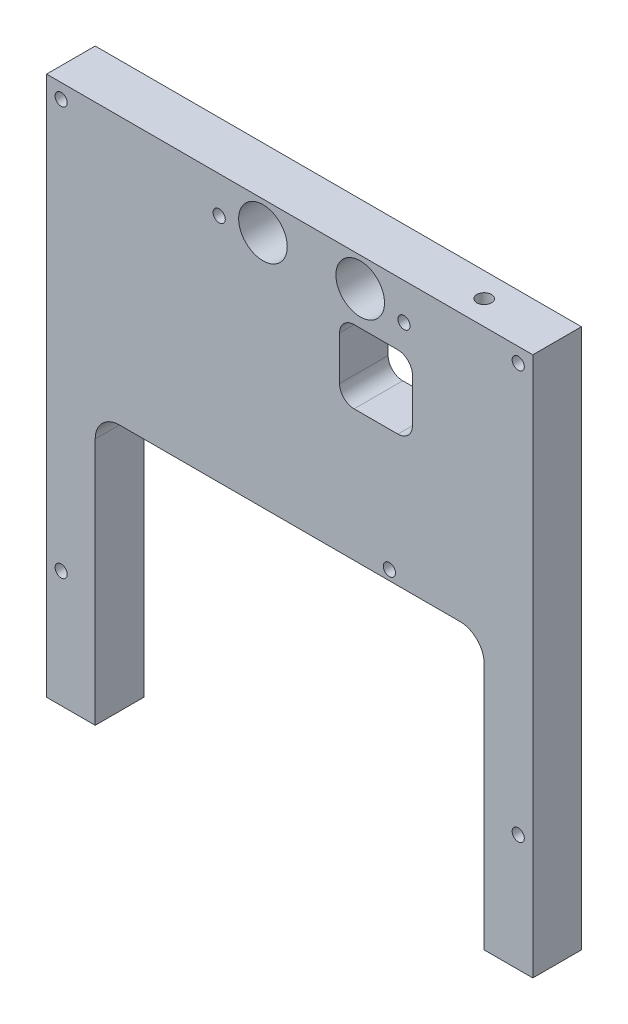
ISO-10303-21;
HEADER;
FILE_DESCRIPTION(('STEP AP214'),'2;1');
FILE_NAME('part.step','',(''),(''),'','','');
FILE_SCHEMA(('AUTOMOTIVE_DESIGN { 1 0 10303 214 1 1 1 1 }'));
ENDSEC;
DATA;
#1=APPLICATION_CONTEXT('core data for automotive mechanical design processes');
#2=APPLICATION_PROTOCOL_DEFINITION('international standard','automotive_design',2000,#1);
#3=PRODUCT_CONTEXT('',#1,'mechanical');
#4=PRODUCT('Part','Part','',(#3));
#5=PRODUCT_RELATED_PRODUCT_CATEGORY('part','',(#4));
#6=PRODUCT_DEFINITION_FORMATION('','',#4);
#7=PRODUCT_DEFINITION_CONTEXT('part definition',#1,'design');
#8=PRODUCT_DEFINITION('design','',#6,#7);
#9=PRODUCT_DEFINITION_SHAPE('','',#8);
#10=(LENGTH_UNIT() NAMED_UNIT(*) SI_UNIT(.MILLI.,.METRE.));
#11=(NAMED_UNIT(*) PLANE_ANGLE_UNIT() SI_UNIT($,.RADIAN.));
#12=(NAMED_UNIT(*) SI_UNIT($,.STERADIAN.) SOLID_ANGLE_UNIT());
#13=UNCERTAINTY_MEASURE_WITH_UNIT(LENGTH_MEASURE(1.E-05),#10,'distance_accuracy_value','');
#14=(GEOMETRIC_REPRESENTATION_CONTEXT(3) GLOBAL_UNCERTAINTY_ASSIGNED_CONTEXT((#13)) GLOBAL_UNIT_ASSIGNED_CONTEXT((#10,
#11,#12)) REPRESENTATION_CONTEXT('',''));
#15=CARTESIAN_POINT('',(0.,0.,0.));
#16=DIRECTION('',(0.,0.,1.));
#17=DIRECTION('',(1.,0.,0.));
#18=AXIS2_PLACEMENT_3D('',#15,#16,#17);
#19=CARTESIAN_POINT('',(35.,60.,10.));
#20=DIRECTION('',(0.,0.,1.));
#21=DIRECTION('',(1.,0.,0.));
#22=AXIS2_PLACEMENT_3D('',#19,#20,#21);
#23=PLANE('',#22);
#24=CARTESIAN_POINT('',(23.5,112.5,10.));
#25=DIRECTION('',(0.,0.,-1.));
#26=DIRECTION('',(-1.,0.,0.));
#27=AXIS2_PLACEMENT_3D('',#24,#25,#26);
#28=CIRCLE('',#27,1.25);
#29=CARTESIAN_POINT('',(22.25,112.5,10.));
#30=VERTEX_POINT('',#29);
#31=EDGE_CURVE('E411',#30,#30,#28,.T.);
#32=ORIENTED_EDGE('',*,*,#31,.T.);
#33=EDGE_LOOP('',(#32));
#34=FACE_BOUND('',#33,.T.);
#35=CARTESIAN_POINT('',(-14.5,112.5,10.));
#36=DIRECTION('',(0.,0.,-1.));
#37=DIRECTION('',(-1.,0.,0.));
#38=AXIS2_PLACEMENT_3D('',#35,#36,#37);
#39=CIRCLE('',#38,1.25);
#40=CARTESIAN_POINT('',(-15.75,112.5,10.));
#41=VERTEX_POINT('',#40);
#42=EDGE_CURVE('E418',#41,#41,#39,.T.);
#43=ORIENTED_EDGE('',*,*,#42,.T.);
#44=EDGE_LOOP('',(#43));
#45=FACE_BOUND('',#44,.T.);
#46=CARTESIAN_POINT('',(20.5,67.,10.));
#47=DIRECTION('',(0.,0.,-1.));
#48=DIRECTION('',(-1.,0.,0.));
#49=AXIS2_PLACEMENT_3D('',#46,#47,#48);
#50=CIRCLE('',#49,1.25);
#51=CARTESIAN_POINT('',(19.25,67.,10.));
#52=VERTEX_POINT('',#51);
#53=EDGE_CURVE('E424',#52,#52,#50,.T.);
#54=ORIENTED_EDGE('',*,*,#53,.T.);
#55=EDGE_LOOP('',(#54));
#56=FACE_BOUND('',#55,.T.);
#57=CARTESIAN_POINT('',(47.,117.,10.));
#58=DIRECTION('',(0.,0.,-1.));
#59=DIRECTION('',(-1.,0.,0.));
#60=AXIS2_PLACEMENT_3D('',#57,#58,#59);
#61=CIRCLE('',#60,1.24999999999999);
#62=CARTESIAN_POINT('',(45.75,117.,10.));
#63=VERTEX_POINT('',#62);
#64=EDGE_CURVE('E430',#63,#63,#61,.T.);
#65=ORIENTED_EDGE('',*,*,#64,.T.);
#66=EDGE_LOOP('',(#65));
#67=FACE_BOUND('',#66,.T.);
#68=CARTESIAN_POINT('',(-47.,117.,10.));
#69=DIRECTION('',(0.,0.,-1.));
#70=DIRECTION('',(-1.,0.,0.));
#71=AXIS2_PLACEMENT_3D('',#68,#69,#70);
#72=CIRCLE('',#71,1.24999999999999);
#73=CARTESIAN_POINT('',(-48.25,117.,10.));
#74=VERTEX_POINT('',#73);
#75=EDGE_CURVE('E436',#74,#74,#72,.T.);
#76=ORIENTED_EDGE('',*,*,#75,.T.);
#77=EDGE_LOOP('',(#76));
#78=FACE_BOUND('',#77,.T.);
#79=CARTESIAN_POINT('',(-47.,33.,10.));
#80=DIRECTION('',(0.,0.,-1.));
#81=DIRECTION('',(-1.,0.,0.));
#82=AXIS2_PLACEMENT_3D('',#79,#80,#81);
#83=CIRCLE('',#82,1.24999999999999);
#84=CARTESIAN_POINT('',(-48.25,33.,10.));
#85=VERTEX_POINT('',#84);
#86=EDGE_CURVE('E442',#85,#85,#83,.T.);
#87=ORIENTED_EDGE('',*,*,#86,.T.);
#88=EDGE_LOOP('',(#87));
#89=FACE_BOUND('',#88,.T.);
#90=CARTESIAN_POINT('',(47.,33.,10.));
#91=DIRECTION('',(0.,0.,-1.));
#92=DIRECTION('',(-1.,0.,0.));
#93=AXIS2_PLACEMENT_3D('',#90,#91,#92);
#94=CIRCLE('',#93,1.24999999999999);
#95=CARTESIAN_POINT('',(45.75,33.,10.));
#96=VERTEX_POINT('',#95);
#97=EDGE_CURVE('E448',#96,#96,#94,.T.);
#98=ORIENTED_EDGE('',*,*,#97,.T.);
#99=EDGE_LOOP('',(#98));
#100=FACE_BOUND('',#99,.T.);
#101=CARTESIAN_POINT('',(-5.5,114.,10.));
#102=DIRECTION('',(0.,0.,1.));
#103=DIRECTION('',(1.,0.,0.));
#104=AXIS2_PLACEMENT_3D('',#101,#102,#103);
#105=CIRCLE('',#104,5.);
#106=CARTESIAN_POINT('',(-0.499999999999995,114.,10.));
#107=VERTEX_POINT('',#106);
#108=EDGE_CURVE('E230',#107,#107,#105,.T.);
#109=ORIENTED_EDGE('',*,*,#108,.F.);
#110=EDGE_LOOP('',(#109));
#111=FACE_BOUND('',#110,.T.);
#112=DIRECTION('',(0.,1.,0.));
#113=VECTOR('',#112,1.);
#114=CARTESIAN_POINT('',(-40.,60.,10.));
#115=LINE('',#114,#113);
#116=CARTESIAN_POINT('',(-40.,8.99999999999998,10.));
#117=VERTEX_POINT('',#116);
#118=CARTESIAN_POINT('',(-40.,60.,10.));
#119=VERTEX_POINT('',#118);
#120=EDGE_CURVE('E254',#117,#119,#115,.T.);
#121=ORIENTED_EDGE('',*,*,#120,.T.);
#122=CARTESIAN_POINT('',(-35.,60.,10.));
#123=DIRECTION('',(0.,0.,-1.));
#124=DIRECTION('',(1.,0.,0.));
#125=AXIS2_PLACEMENT_3D('',#122,#123,#124);
#126=CIRCLE('',#125,5.);
#127=CARTESIAN_POINT('',(-35.,65.,10.));
#128=VERTEX_POINT('',#127);
#129=EDGE_CURVE('E257',#119,#128,#126,.T.);
#130=ORIENTED_EDGE('',*,*,#129,.T.);
#131=DIRECTION('',(1.,0.,0.));
#132=VECTOR('',#131,1.);
#133=CARTESIAN_POINT('',(35.,65.,10.));
#134=LINE('',#133,#132);
#135=CARTESIAN_POINT('',(35.,65.,10.));
#136=VERTEX_POINT('',#135);
#137=EDGE_CURVE('E260',#128,#136,#134,.T.);
#138=ORIENTED_EDGE('',*,*,#137,.T.);
#139=CARTESIAN_POINT('',(35.,60.,10.));
#140=DIRECTION('',(0.,0.,-1.));
#141=DIRECTION('',(1.,0.,0.));
#142=AXIS2_PLACEMENT_3D('',#139,#140,#141);
#143=CIRCLE('',#142,5.);
#144=CARTESIAN_POINT('',(40.,60.,10.));
#145=VERTEX_POINT('',#144);
#146=EDGE_CURVE('E262',#136,#145,#143,.T.);
#147=ORIENTED_EDGE('',*,*,#146,.T.);
#148=DIRECTION('',(0.,-1.,0.));
#149=VECTOR('',#148,1.);
#150=CARTESIAN_POINT('',(40.,8.99999999999998,10.));
#151=LINE('',#150,#149);
#152=CARTESIAN_POINT('',(40.,8.99999999999998,10.));
#153=VERTEX_POINT('',#152);
#154=EDGE_CURVE('E264',#145,#153,#151,.T.);
#155=ORIENTED_EDGE('',*,*,#154,.T.);
#156=DIRECTION('',(1.,0.,0.));
#157=VECTOR('',#156,1.);
#158=CARTESIAN_POINT('',(50.,8.99999999999998,10.));
#159=LINE('',#158,#157);
#160=CARTESIAN_POINT('',(50.,8.99999999999998,10.));
#161=VERTEX_POINT('',#160);
#162=EDGE_CURVE('E266',#153,#161,#159,.T.);
#163=ORIENTED_EDGE('',*,*,#162,.T.);
#164=DIRECTION('',(0.,1.,0.));
#165=VECTOR('',#164,1.);
#166=CARTESIAN_POINT('',(50.,120.,10.));
#167=LINE('',#166,#165);
#168=CARTESIAN_POINT('',(50.,120.,10.));
#169=VERTEX_POINT('',#168);
#170=EDGE_CURVE('E268',#161,#169,#167,.T.);
#171=ORIENTED_EDGE('',*,*,#170,.T.);
#172=DIRECTION('',(-1.,0.,0.));
#173=VECTOR('',#172,1.);
#174=CARTESIAN_POINT('',(-50.,120.,10.));
#175=LINE('',#174,#173);
#176=CARTESIAN_POINT('',(-50.,120.,10.));
#177=VERTEX_POINT('',#176);
#178=EDGE_CURVE('E270',#169,#177,#175,.T.);
#179=ORIENTED_EDGE('',*,*,#178,.T.);
#180=DIRECTION('',(0.,-1.,0.));
#181=VECTOR('',#180,1.);
#182=CARTESIAN_POINT('',(-50.,8.99999999999998,10.));
#183=LINE('',#182,#181);
#184=CARTESIAN_POINT('',(-50.,8.99999999999998,10.));
#185=VERTEX_POINT('',#184);
#186=EDGE_CURVE('E272',#177,#185,#183,.T.);
#187=ORIENTED_EDGE('',*,*,#186,.T.);
#188=DIRECTION('',(1.,0.,0.));
#189=VECTOR('',#188,1.);
#190=CARTESIAN_POINT('',(-40.,8.99999999999998,10.));
#191=LINE('',#190,#189);
#192=EDGE_CURVE('E274',#185,#117,#191,.T.);
#193=ORIENTED_EDGE('',*,*,#192,.T.);
#194=EDGE_LOOP('',(#121,#130,#138,#147,#155,#163,#171,#179,#187,#193));
#195=FACE_BOUND('',#194,.T.);
#196=CARTESIAN_POINT('',(14.5,114.,10.));
#197=DIRECTION('',(0.,0.,1.));
#198=DIRECTION('',(1.,0.,0.));
#199=AXIS2_PLACEMENT_3D('',#196,#197,#198);
#200=CIRCLE('',#199,5.);
#201=CARTESIAN_POINT('',(19.5,114.,10.));
#202=VERTEX_POINT('',#201);
#203=EDGE_CURVE('E236',#202,#202,#200,.T.);
#204=ORIENTED_EDGE('',*,*,#203,.F.);
#205=EDGE_LOOP('',(#204));
#206=FACE_BOUND('',#205,.T.);
#207=DIRECTION('',(-1.,0.,0.));
#208=VECTOR('',#207,1.);
#209=CARTESIAN_POINT('',(22.25,107.,10.));
#210=LINE('',#209,#208);
#211=CARTESIAN_POINT('',(22.25,107.,10.));
#212=VERTEX_POINT('',#211);
#213=CARTESIAN_POINT('',(13.25,107.,10.));
#214=VERTEX_POINT('',#213);
#215=EDGE_CURVE('E171',#212,#214,#210,.T.);
#216=ORIENTED_EDGE('',*,*,#215,.F.);
#217=CARTESIAN_POINT('',(22.25,104.,10.));
#218=DIRECTION('',(0.,0.,1.));
#219=DIRECTION('',(-1.,0.,0.));
#220=AXIS2_PLACEMENT_3D('',#217,#218,#219);
#221=CIRCLE('',#220,2.99999999999999);
#222=CARTESIAN_POINT('',(25.25,104.,10.));
#223=VERTEX_POINT('',#222);
#224=EDGE_CURVE('E163',#223,#212,#221,.T.);
#225=ORIENTED_EDGE('',*,*,#224,.F.);
#226=DIRECTION('',(0.,1.,0.));
#227=VECTOR('',#226,1.);
#228=CARTESIAN_POINT('',(25.25,104.,10.));
#229=LINE('',#228,#227);
#230=CARTESIAN_POINT('',(25.25,95.,10.));
#231=VERTEX_POINT('',#230);
#232=EDGE_CURVE('E197',#231,#223,#229,.T.);
#233=ORIENTED_EDGE('',*,*,#232,.F.);
#234=CARTESIAN_POINT('',(22.25,95.,10.));
#235=DIRECTION('',(0.,0.,1.));
#236=DIRECTION('',(-1.,0.,0.));
#237=AXIS2_PLACEMENT_3D('',#234,#235,#236);
#238=CIRCLE('',#237,3.00000000000001);
#239=CARTESIAN_POINT('',(22.25,92.,10.));
#240=VERTEX_POINT('',#239);
#241=EDGE_CURVE('E195',#240,#231,#238,.T.);
#242=ORIENTED_EDGE('',*,*,#241,.F.);
#243=DIRECTION('',(1.,0.,0.));
#244=VECTOR('',#243,1.);
#245=CARTESIAN_POINT('',(22.25,92.,10.));
#246=LINE('',#245,#244);
#247=CARTESIAN_POINT('',(13.25,92.,10.));
#248=VERTEX_POINT('',#247);
#249=EDGE_CURVE('E193',#248,#240,#246,.T.);
#250=ORIENTED_EDGE('',*,*,#249,.F.);
#251=CARTESIAN_POINT('',(13.25,95.,10.));
#252=DIRECTION('',(0.,0.,1.));
#253=DIRECTION('',(-1.,0.,0.));
#254=AXIS2_PLACEMENT_3D('',#251,#252,#253);
#255=CIRCLE('',#254,3.);
#256=CARTESIAN_POINT('',(10.25,95.,10.));
#257=VERTEX_POINT('',#256);
#258=EDGE_CURVE('E191',#257,#248,#255,.T.);
#259=ORIENTED_EDGE('',*,*,#258,.F.);
#260=DIRECTION('',(0.,-1.,0.));
#261=VECTOR('',#260,1.);
#262=CARTESIAN_POINT('',(10.25,104.,10.));
#263=LINE('',#262,#261);
#264=CARTESIAN_POINT('',(10.25,104.,10.));
#265=VERTEX_POINT('',#264);
#266=EDGE_CURVE('E186',#265,#257,#263,.T.);
#267=ORIENTED_EDGE('',*,*,#266,.F.);
#268=CARTESIAN_POINT('',(13.25,104.,10.));
#269=DIRECTION('',(0.,0.,1.));
#270=DIRECTION('',(1.,0.,0.));
#271=AXIS2_PLACEMENT_3D('',#268,#269,#270);
#272=CIRCLE('',#271,2.99999999999999);
#273=EDGE_CURVE('E184',#214,#265,#272,.T.);
#274=ORIENTED_EDGE('',*,*,#273,.F.);
#275=EDGE_LOOP('',(#216,#225,#233,#242,#250,#259,#267,#274));
#276=FACE_BOUND('',#275,.T.);
#277=ADVANCED_FACE('F32',(#34,#45,#56,#67,#78,#89,#100,#111,#195,#206,#276),#23,.T.);
#278=CARTESIAN_POINT('',(35.,60.,0.));
#279=DIRECTION('',(0.,0.,1.));
#280=DIRECTION('',(1.,0.,0.));
#281=AXIS2_PLACEMENT_3D('',#278,#279,#280);
#282=PLANE('',#281);
#283=CARTESIAN_POINT('',(23.5,112.5,0.));
#284=DIRECTION('',(0.,0.,-1.));
#285=DIRECTION('',(-1.,0.,0.));
#286=AXIS2_PLACEMENT_3D('',#283,#284,#285);
#287=CIRCLE('',#286,1.24999999999999);
#288=CARTESIAN_POINT('',(22.25,112.5,0.));
#289=VERTEX_POINT('',#288);
#290=EDGE_CURVE('E415',#289,#289,#287,.T.);
#291=ORIENTED_EDGE('',*,*,#290,.F.);
#292=EDGE_LOOP('',(#291));
#293=FACE_BOUND('',#292,.T.);
#294=CARTESIAN_POINT('',(-14.5,112.5,0.));
#295=DIRECTION('',(0.,0.,-1.));
#296=DIRECTION('',(-1.,0.,0.));
#297=AXIS2_PLACEMENT_3D('',#294,#295,#296);
#298=CIRCLE('',#297,1.24999999999999);
#299=CARTESIAN_POINT('',(-15.75,112.5,0.));
#300=VERTEX_POINT('',#299);
#301=EDGE_CURVE('E421',#300,#300,#298,.T.);
#302=ORIENTED_EDGE('',*,*,#301,.F.);
#303=EDGE_LOOP('',(#302));
#304=FACE_BOUND('',#303,.T.);
#305=CARTESIAN_POINT('',(20.5,67.,0.));
#306=DIRECTION('',(0.,0.,-1.));
#307=DIRECTION('',(-1.,0.,0.));
#308=AXIS2_PLACEMENT_3D('',#305,#306,#307);
#309=CIRCLE('',#308,1.24999999999999);
#310=CARTESIAN_POINT('',(19.25,67.,0.));
#311=VERTEX_POINT('',#310);
#312=EDGE_CURVE('E427',#311,#311,#309,.T.);
#313=ORIENTED_EDGE('',*,*,#312,.F.);
#314=EDGE_LOOP('',(#313));
#315=FACE_BOUND('',#314,.T.);
#316=CARTESIAN_POINT('',(47.,117.,0.));
#317=DIRECTION('',(0.,0.,-1.));
#318=DIRECTION('',(-1.,0.,0.));
#319=AXIS2_PLACEMENT_3D('',#316,#317,#318);
#320=CIRCLE('',#319,1.24999999999999);
#321=CARTESIAN_POINT('',(45.75,117.,0.));
#322=VERTEX_POINT('',#321);
#323=EDGE_CURVE('E433',#322,#322,#320,.T.);
#324=ORIENTED_EDGE('',*,*,#323,.F.);
#325=EDGE_LOOP('',(#324));
#326=FACE_BOUND('',#325,.T.);
#327=CARTESIAN_POINT('',(-47.,117.,0.));
#328=DIRECTION('',(0.,0.,-1.));
#329=DIRECTION('',(-1.,0.,0.));
#330=AXIS2_PLACEMENT_3D('',#327,#328,#329);
#331=CIRCLE('',#330,1.24999999999999);
#332=CARTESIAN_POINT('',(-48.25,117.,0.));
#333=VERTEX_POINT('',#332);
#334=EDGE_CURVE('E439',#333,#333,#331,.T.);
#335=ORIENTED_EDGE('',*,*,#334,.F.);
#336=EDGE_LOOP('',(#335));
#337=FACE_BOUND('',#336,.T.);
#338=CARTESIAN_POINT('',(-47.,33.,0.));
#339=DIRECTION('',(0.,0.,-1.));
#340=DIRECTION('',(-1.,0.,0.));
#341=AXIS2_PLACEMENT_3D('',#338,#339,#340);
#342=CIRCLE('',#341,1.24999999999999);
#343=CARTESIAN_POINT('',(-48.25,33.,0.));
#344=VERTEX_POINT('',#343);
#345=EDGE_CURVE('E445',#344,#344,#342,.T.);
#346=ORIENTED_EDGE('',*,*,#345,.F.);
#347=EDGE_LOOP('',(#346));
#348=FACE_BOUND('',#347,.T.);
#349=CARTESIAN_POINT('',(47.,33.,0.));
#350=DIRECTION('',(0.,0.,-1.));
#351=DIRECTION('',(-1.,0.,0.));
#352=AXIS2_PLACEMENT_3D('',#349,#350,#351);
#353=CIRCLE('',#352,1.24999999999999);
#354=CARTESIAN_POINT('',(45.75,33.,0.));
#355=VERTEX_POINT('',#354);
#356=EDGE_CURVE('E200',#355,#355,#353,.T.);
#357=ORIENTED_EDGE('',*,*,#356,.F.);
#358=EDGE_LOOP('',(#357));
#359=FACE_BOUND('',#358,.T.);
#360=CARTESIAN_POINT('',(-5.5,114.,0.));
#361=DIRECTION('',(0.,0.,1.));
#362=DIRECTION('',(1.,0.,0.));
#363=AXIS2_PLACEMENT_3D('',#360,#361,#362);
#364=CIRCLE('',#363,5.);
#365=CARTESIAN_POINT('',(-0.499999999999995,114.,0.));
#366=VERTEX_POINT('',#365);
#367=EDGE_CURVE('E179',#366,#366,#364,.T.);
#368=ORIENTED_EDGE('',*,*,#367,.T.);
#369=EDGE_LOOP('',(#368));
#370=FACE_BOUND('',#369,.T.);
#371=DIRECTION('',(0.,1.,0.));
#372=VECTOR('',#371,1.);
#373=CARTESIAN_POINT('',(-40.,60.,0.));
#374=LINE('',#373,#372);
#375=CARTESIAN_POINT('',(-40.,8.99999999999998,0.));
#376=VERTEX_POINT('',#375);
#377=CARTESIAN_POINT('',(-40.,60.,0.));
#378=VERTEX_POINT('',#377);
#379=EDGE_CURVE('E253',#376,#378,#374,.T.);
#380=ORIENTED_EDGE('',*,*,#379,.F.);
#381=DIRECTION('',(1.,0.,0.));
#382=VECTOR('',#381,1.);
#383=CARTESIAN_POINT('',(-40.,8.99999999999998,0.));
#384=LINE('',#383,#382);
#385=CARTESIAN_POINT('',(-50.,8.99999999999998,0.));
#386=VERTEX_POINT('',#385);
#387=EDGE_CURVE('E258',#386,#376,#384,.T.);
#388=ORIENTED_EDGE('',*,*,#387,.F.);
#389=DIRECTION('',(0.,-1.,0.));
#390=VECTOR('',#389,1.);
#391=CARTESIAN_POINT('',(-50.,8.99999999999998,0.));
#392=LINE('',#391,#390);
#393=CARTESIAN_POINT('',(-50.,120.,0.));
#394=VERTEX_POINT('',#393);
#395=EDGE_CURVE('E293',#394,#386,#392,.T.);
#396=ORIENTED_EDGE('',*,*,#395,.F.);
#397=DIRECTION('',(-1.,0.,0.));
#398=VECTOR('',#397,1.);
#399=CARTESIAN_POINT('',(-50.,120.,0.));
#400=LINE('',#399,#398);
#401=CARTESIAN_POINT('',(50.,120.,0.));
#402=VERTEX_POINT('',#401);
#403=EDGE_CURVE('E291',#402,#394,#400,.T.);
#404=ORIENTED_EDGE('',*,*,#403,.F.);
#405=DIRECTION('',(0.,1.,0.));
#406=VECTOR('',#405,1.);
#407=CARTESIAN_POINT('',(50.,120.,0.));
#408=LINE('',#407,#406);
#409=CARTESIAN_POINT('',(50.,8.99999999999998,0.));
#410=VERTEX_POINT('',#409);
#411=EDGE_CURVE('E289',#410,#402,#408,.T.);
#412=ORIENTED_EDGE('',*,*,#411,.F.);
#413=DIRECTION('',(1.,0.,0.));
#414=VECTOR('',#413,1.);
#415=CARTESIAN_POINT('',(50.,8.99999999999998,0.));
#416=LINE('',#415,#414);
#417=CARTESIAN_POINT('',(40.,8.99999999999998,0.));
#418=VERTEX_POINT('',#417);
#419=EDGE_CURVE('E287',#418,#410,#416,.T.);
#420=ORIENTED_EDGE('',*,*,#419,.F.);
#421=DIRECTION('',(0.,-1.,0.));
#422=VECTOR('',#421,1.);
#423=CARTESIAN_POINT('',(40.,8.99999999999998,0.));
#424=LINE('',#423,#422);
#425=CARTESIAN_POINT('',(40.,60.,0.));
#426=VERTEX_POINT('',#425);
#427=EDGE_CURVE('E285',#426,#418,#424,.T.);
#428=ORIENTED_EDGE('',*,*,#427,.F.);
#429=CARTESIAN_POINT('',(35.,60.,0.));
#430=DIRECTION('',(0.,0.,-1.));
#431=DIRECTION('',(1.,0.,0.));
#432=AXIS2_PLACEMENT_3D('',#429,#430,#431);
#433=CIRCLE('',#432,5.);
#434=CARTESIAN_POINT('',(35.,65.,0.));
#435=VERTEX_POINT('',#434);
#436=EDGE_CURVE('E283',#435,#426,#433,.T.);
#437=ORIENTED_EDGE('',*,*,#436,.F.);
#438=DIRECTION('',(1.,0.,0.));
#439=VECTOR('',#438,1.);
#440=CARTESIAN_POINT('',(35.,65.,0.));
#441=LINE('',#440,#439);
#442=CARTESIAN_POINT('',(-35.,65.,0.));
#443=VERTEX_POINT('',#442);
#444=EDGE_CURVE('E281',#443,#435,#441,.T.);
#445=ORIENTED_EDGE('',*,*,#444,.F.);
#446=CARTESIAN_POINT('',(-35.,60.,0.));
#447=DIRECTION('',(0.,0.,-1.));
#448=DIRECTION('',(1.,0.,0.));
#449=AXIS2_PLACEMENT_3D('',#446,#447,#448);
#450=CIRCLE('',#449,5.);
#451=EDGE_CURVE('E279',#378,#443,#450,.T.);
#452=ORIENTED_EDGE('',*,*,#451,.F.);
#453=EDGE_LOOP('',(#380,#388,#396,#404,#412,#420,#428,#437,#445,#452));
#454=FACE_BOUND('',#453,.T.);
#455=CARTESIAN_POINT('',(14.5,114.,0.));
#456=DIRECTION('',(0.,0.,1.));
#457=DIRECTION('',(1.,0.,0.));
#458=AXIS2_PLACEMENT_3D('',#455,#456,#457);
#459=CIRCLE('',#458,5.);
#460=CARTESIAN_POINT('',(19.5,114.,0.));
#461=VERTEX_POINT('',#460);
#462=EDGE_CURVE('E233',#461,#461,#459,.T.);
#463=ORIENTED_EDGE('',*,*,#462,.T.);
#464=EDGE_LOOP('',(#463));
#465=FACE_BOUND('',#464,.T.);
#466=CARTESIAN_POINT('',(22.25,104.,0.));
#467=DIRECTION('',(0.,0.,1.));
#468=DIRECTION('',(-1.,0.,0.));
#469=AXIS2_PLACEMENT_3D('',#466,#467,#468);
#470=CIRCLE('',#469,2.99999999999999);
#471=CARTESIAN_POINT('',(25.25,104.,0.));
#472=VERTEX_POINT('',#471);
#473=CARTESIAN_POINT('',(22.25,107.,0.));
#474=VERTEX_POINT('',#473);
#475=EDGE_CURVE('E55',#472,#474,#470,.T.);
#476=ORIENTED_EDGE('',*,*,#475,.T.);
#477=DIRECTION('',(-1.,0.,0.));
#478=VECTOR('',#477,1.);
#479=CARTESIAN_POINT('',(22.25,107.,0.));
#480=LINE('',#479,#478);
#481=CARTESIAN_POINT('',(13.25,107.,0.));
#482=VERTEX_POINT('',#481);
#483=EDGE_CURVE('E178',#474,#482,#480,.T.);
#484=ORIENTED_EDGE('',*,*,#483,.T.);
#485=CARTESIAN_POINT('',(13.25,104.,0.));
#486=DIRECTION('',(0.,0.,1.));
#487=DIRECTION('',(1.,0.,0.));
#488=AXIS2_PLACEMENT_3D('',#485,#486,#487);
#489=CIRCLE('',#488,2.99999999999999);
#490=CARTESIAN_POINT('',(10.25,104.,0.));
#491=VERTEX_POINT('',#490);
#492=EDGE_CURVE('E202',#482,#491,#489,.T.);
#493=ORIENTED_EDGE('',*,*,#492,.T.);
#494=DIRECTION('',(0.,-1.,0.));
#495=VECTOR('',#494,1.);
#496=CARTESIAN_POINT('',(10.25,104.,0.));
#497=LINE('',#496,#495);
#498=CARTESIAN_POINT('',(10.25,95.,0.));
#499=VERTEX_POINT('',#498);
#500=EDGE_CURVE('E205',#491,#499,#497,.T.);
#501=ORIENTED_EDGE('',*,*,#500,.T.);
#502=CARTESIAN_POINT('',(13.25,95.,0.));
#503=DIRECTION('',(0.,0.,1.));
#504=DIRECTION('',(-1.,0.,0.));
#505=AXIS2_PLACEMENT_3D('',#502,#503,#504);
#506=CIRCLE('',#505,3.);
#507=CARTESIAN_POINT('',(13.25,92.,0.));
#508=VERTEX_POINT('',#507);
#509=EDGE_CURVE('E208',#499,#508,#506,.T.);
#510=ORIENTED_EDGE('',*,*,#509,.T.);
#511=DIRECTION('',(1.,0.,0.));
#512=VECTOR('',#511,1.);
#513=CARTESIAN_POINT('',(22.25,92.,0.));
#514=LINE('',#513,#512);
#515=CARTESIAN_POINT('',(22.25,92.,0.));
#516=VERTEX_POINT('',#515);
#517=EDGE_CURVE('E211',#508,#516,#514,.T.);
#518=ORIENTED_EDGE('',*,*,#517,.T.);
#519=CARTESIAN_POINT('',(22.25,95.,0.));
#520=DIRECTION('',(0.,0.,1.));
#521=DIRECTION('',(-1.,0.,0.));
#522=AXIS2_PLACEMENT_3D('',#519,#520,#521);
#523=CIRCLE('',#522,3.00000000000001);
#524=CARTESIAN_POINT('',(25.25,95.,0.));
#525=VERTEX_POINT('',#524);
#526=EDGE_CURVE('E214',#516,#525,#523,.T.);
#527=ORIENTED_EDGE('',*,*,#526,.T.);
#528=DIRECTION('',(0.,1.,0.));
#529=VECTOR('',#528,1.);
#530=CARTESIAN_POINT('',(25.25,104.,0.));
#531=LINE('',#530,#529);
#532=EDGE_CURVE('E172',#525,#472,#531,.T.);
#533=ORIENTED_EDGE('',*,*,#532,.T.);
#534=EDGE_LOOP('',(#476,#484,#493,#501,#510,#518,#527,#533));
#535=FACE_BOUND('',#534,.T.);
#536=ADVANCED_FACE('F329',(#293,#304,#315,#326,#337,#348,#359,#370,#454,#465,#535),#282,.F.);
#537=CARTESIAN_POINT('',(-40.,60.,10.));
#538=DIRECTION('',(-1.,0.,0.));
#539=DIRECTION('',(0.,0.,1.));
#540=AXIS2_PLACEMENT_3D('',#537,#538,#539);
#541=PLANE('',#540);
#542=ORIENTED_EDGE('',*,*,#379,.T.);
#543=DIRECTION('',(0.,0.,-1.));
#544=VECTOR('',#543,1.);
#545=CARTESIAN_POINT('',(-40.,60.,10.));
#546=LINE('',#545,#544);
#547=EDGE_CURVE('E11',#119,#378,#546,.T.);
#548=ORIENTED_EDGE('',*,*,#547,.F.);
#549=ORIENTED_EDGE('',*,*,#120,.F.);
#550=DIRECTION('',(0.,0.,-1.));
#551=VECTOR('',#550,1.);
#552=CARTESIAN_POINT('',(-40.,8.99999999999998,10.));
#553=LINE('',#552,#551);
#554=EDGE_CURVE('E276',#117,#376,#553,.T.);
#555=ORIENTED_EDGE('',*,*,#554,.T.);
#556=EDGE_LOOP('',(#542,#548,#549,#555));
#557=FACE_BOUND('',#556,.T.);
#558=ADVANCED_FACE('F34',(#557),#541,.F.);
#559=CARTESIAN_POINT('',(-35.,60.,10.));
#560=DIRECTION('',(0.,0.,-1.));
#561=DIRECTION('',(-1.,0.,0.));
#562=AXIS2_PLACEMENT_3D('',#559,#560,#561);
#563=CYLINDRICAL_SURFACE('',#562,5.);
#564=ORIENTED_EDGE('',*,*,#451,.T.);
#565=DIRECTION('',(0.,0.,-1.));
#566=VECTOR('',#565,1.);
#567=CARTESIAN_POINT('',(-35.,65.,10.));
#568=LINE('',#567,#566);
#569=EDGE_CURVE('E40',#128,#443,#568,.T.);
#570=ORIENTED_EDGE('',*,*,#569,.F.);
#571=ORIENTED_EDGE('',*,*,#129,.F.);
#572=ORIENTED_EDGE('',*,*,#547,.T.);
#573=EDGE_LOOP('',(#564,#570,#571,#572));
#574=FACE_BOUND('',#573,.T.);
#575=ADVANCED_FACE('F347',(#574),#563,.F.);
#576=CARTESIAN_POINT('',(35.,65.,10.));
#577=DIRECTION('',(0.,1.,0.));
#578=DIRECTION('',(0.,0.,1.));
#579=AXIS2_PLACEMENT_3D('',#576,#577,#578);
#580=PLANE('',#579);
#581=ORIENTED_EDGE('',*,*,#444,.T.);
#582=DIRECTION('',(0.,0.,-1.));
#583=VECTOR('',#582,1.);
#584=CARTESIAN_POINT('',(35.,65.,10.));
#585=LINE('',#584,#583);
#586=EDGE_CURVE('E316',#136,#435,#585,.T.);
#587=ORIENTED_EDGE('',*,*,#586,.F.);
#588=ORIENTED_EDGE('',*,*,#137,.F.);
#589=ORIENTED_EDGE('',*,*,#569,.T.);
#590=EDGE_LOOP('',(#581,#587,#588,#589));
#591=FACE_BOUND('',#590,.T.);
#592=ADVANCED_FACE('F323',(#591),#580,.F.);
#593=CARTESIAN_POINT('',(35.,60.,10.));
#594=DIRECTION('',(0.,0.,-1.));
#595=DIRECTION('',(-1.,0.,0.));
#596=AXIS2_PLACEMENT_3D('',#593,#594,#595);
#597=CYLINDRICAL_SURFACE('',#596,5.);
#598=ORIENTED_EDGE('',*,*,#436,.T.);
#599=DIRECTION('',(0.,0.,-1.));
#600=VECTOR('',#599,1.);
#601=CARTESIAN_POINT('',(40.,60.,10.));
#602=LINE('',#601,#600);
#603=EDGE_CURVE('E313',#145,#426,#602,.T.);
#604=ORIENTED_EDGE('',*,*,#603,.F.);
#605=ORIENTED_EDGE('',*,*,#146,.F.);
#606=ORIENTED_EDGE('',*,*,#586,.T.);
#607=EDGE_LOOP('',(#598,#604,#605,#606));
#608=FACE_BOUND('',#607,.T.);
#609=ADVANCED_FACE('F335',(#608),#597,.F.);
#610=CARTESIAN_POINT('',(40.,8.99999999999998,10.));
#611=DIRECTION('',(1.,0.,0.));
#612=DIRECTION('',(0.,0.,-1.));
#613=AXIS2_PLACEMENT_3D('',#610,#611,#612);
#614=PLANE('',#613);
#615=ORIENTED_EDGE('',*,*,#427,.T.);
#616=DIRECTION('',(0.,0.,-1.));
#617=VECTOR('',#616,1.);
#618=CARTESIAN_POINT('',(40.,8.99999999999998,10.));
#619=LINE('',#618,#617);
#620=EDGE_CURVE('E310',#153,#418,#619,.T.);
#621=ORIENTED_EDGE('',*,*,#620,.F.);
#622=ORIENTED_EDGE('',*,*,#154,.F.);
#623=ORIENTED_EDGE('',*,*,#603,.T.);
#624=EDGE_LOOP('',(#615,#621,#622,#623));
#625=FACE_BOUND('',#624,.T.);
#626=ADVANCED_FACE('F339',(#625),#614,.F.);
#627=CARTESIAN_POINT('',(50.,8.99999999999998,10.));
#628=DIRECTION('',(0.,1.,0.));
#629=DIRECTION('',(-1.,0.,0.));
#630=AXIS2_PLACEMENT_3D('',#627,#628,#629);
#631=PLANE('',#630);
#632=CARTESIAN_POINT('',(45.,8.99999999999993,5.));
#633=DIRECTION('',(0.,-1.,0.));
#634=DIRECTION('',(0.,0.,-1.));
#635=AXIS2_PLACEMENT_3D('',#632,#633,#634);
#636=CIRCLE('',#635,1.65);
#637=CARTESIAN_POINT('',(45.,8.99999999999993,3.35));
#638=VERTEX_POINT('',#637);
#639=EDGE_CURVE('E250',#638,#638,#636,.T.);
#640=ORIENTED_EDGE('',*,*,#639,.F.);
#641=EDGE_LOOP('',(#640));
#642=FACE_BOUND('',#641,.T.);
#643=ORIENTED_EDGE('',*,*,#419,.T.);
#644=DIRECTION('',(0.,0.,-1.));
#645=VECTOR('',#644,1.);
#646=CARTESIAN_POINT('',(50.,8.99999999999998,10.));
#647=LINE('',#646,#645);
#648=EDGE_CURVE('E307',#161,#410,#647,.T.);
#649=ORIENTED_EDGE('',*,*,#648,.F.);
#650=ORIENTED_EDGE('',*,*,#162,.F.);
#651=ORIENTED_EDGE('',*,*,#620,.T.);
#652=EDGE_LOOP('',(#643,#649,#650,#651));
#653=FACE_BOUND('',#652,.T.);
#654=ADVANCED_FACE('F370',(#642,#653),#631,.F.);
#655=CARTESIAN_POINT('',(50.,120.,10.));
#656=DIRECTION('',(-1.,0.,0.));
#657=DIRECTION('',(0.,-1.,0.));
#658=AXIS2_PLACEMENT_3D('',#655,#656,#657);
#659=PLANE('',#658);
#660=ORIENTED_EDGE('',*,*,#411,.T.);
#661=DIRECTION('',(0.,0.,-1.));
#662=VECTOR('',#661,1.);
#663=CARTESIAN_POINT('',(50.,120.,10.));
#664=LINE('',#663,#662);
#665=EDGE_CURVE('E304',#169,#402,#664,.T.);
#666=ORIENTED_EDGE('',*,*,#665,.F.);
#667=ORIENTED_EDGE('',*,*,#170,.F.);
#668=ORIENTED_EDGE('',*,*,#648,.T.);
#669=EDGE_LOOP('',(#660,#666,#667,#668));
#670=FACE_BOUND('',#669,.T.);
#671=ADVANCED_FACE('F367',(#670),#659,.F.);
#672=CARTESIAN_POINT('',(-50.,120.,10.));
#673=DIRECTION('',(0.,-1.,0.));
#674=DIRECTION('',(0.,0.,-1.));
#675=AXIS2_PLACEMENT_3D('',#672,#673,#674);
#676=PLANE('',#675);
#677=CARTESIAN_POINT('',(35.,120.,5.));
#678=DIRECTION('',(0.,1.,0.));
#679=DIRECTION('',(0.,0.,1.));
#680=AXIS2_PLACEMENT_3D('',#677,#678,#679);
#681=CIRCLE('',#680,1.5);
#682=CARTESIAN_POINT('',(35.,120.,6.50000000000001));
#683=VERTEX_POINT('',#682);
#684=EDGE_CURVE('E406',#683,#683,#681,.T.);
#685=ORIENTED_EDGE('',*,*,#684,.F.);
#686=EDGE_LOOP('',(#685));
#687=FACE_BOUND('',#686,.T.);
#688=ORIENTED_EDGE('',*,*,#403,.T.);
#689=DIRECTION('',(0.,0.,-1.));
#690=VECTOR('',#689,1.);
#691=CARTESIAN_POINT('',(-50.,120.,10.));
#692=LINE('',#691,#690);
#693=EDGE_CURVE('E301',#177,#394,#692,.T.);
#694=ORIENTED_EDGE('',*,*,#693,.F.);
#695=ORIENTED_EDGE('',*,*,#178,.F.);
#696=ORIENTED_EDGE('',*,*,#665,.T.);
#697=EDGE_LOOP('',(#688,#694,#695,#696));
#698=FACE_BOUND('',#697,.T.);
#699=ADVANCED_FACE('F363',(#687,#698),#676,.F.);
#700=CARTESIAN_POINT('',(-50.,8.99999999999998,10.));
#701=DIRECTION('',(1.,0.,0.));
#702=DIRECTION('',(0.,1.,0.));
#703=AXIS2_PLACEMENT_3D('',#700,#701,#702);
#704=PLANE('',#703);
#705=ORIENTED_EDGE('',*,*,#395,.T.);
#706=DIRECTION('',(0.,0.,-1.));
#707=VECTOR('',#706,1.);
#708=CARTESIAN_POINT('',(-50.,8.99999999999998,10.));
#709=LINE('',#708,#707);
#710=EDGE_CURVE('E298',#185,#386,#709,.T.);
#711=ORIENTED_EDGE('',*,*,#710,.F.);
#712=ORIENTED_EDGE('',*,*,#186,.F.);
#713=ORIENTED_EDGE('',*,*,#693,.T.);
#714=EDGE_LOOP('',(#705,#711,#712,#713));
#715=FACE_BOUND('',#714,.T.);
#716=ADVANCED_FACE('F359',(#715),#704,.F.);
#717=CARTESIAN_POINT('',(-40.,8.99999999999998,10.));
#718=DIRECTION('',(0.,1.,0.));
#719=DIRECTION('',(-1.,0.,0.));
#720=AXIS2_PLACEMENT_3D('',#717,#718,#719);
#721=PLANE('',#720);
#722=CARTESIAN_POINT('',(-45.,9.00000000000007,5.));
#723=DIRECTION('',(0.,-1.,0.));
#724=DIRECTION('',(0.,0.,-1.));
#725=AXIS2_PLACEMENT_3D('',#722,#723,#724);
#726=CIRCLE('',#725,1.65);
#727=CARTESIAN_POINT('',(-45.,9.00000000000007,3.35));
#728=VERTEX_POINT('',#727);
#729=EDGE_CURVE('E244',#728,#728,#726,.T.);
#730=ORIENTED_EDGE('',*,*,#729,.F.);
#731=EDGE_LOOP('',(#730));
#732=FACE_BOUND('',#731,.T.);
#733=ORIENTED_EDGE('',*,*,#387,.T.);
#734=ORIENTED_EDGE('',*,*,#554,.F.);
#735=ORIENTED_EDGE('',*,*,#192,.F.);
#736=ORIENTED_EDGE('',*,*,#710,.T.);
#737=EDGE_LOOP('',(#733,#734,#735,#736));
#738=FACE_BOUND('',#737,.T.);
#739=ADVANCED_FACE('F354',(#732,#738),#721,.F.);
#740=CARTESIAN_POINT('',(45.,8.99999999999993,5.));
#741=DIRECTION('',(0.,-1.,0.));
#742=DIRECTION('',(0.,0.,-1.));
#743=AXIS2_PLACEMENT_3D('',#740,#741,#742);
#744=CYLINDRICAL_SURFACE('',#743,1.65);
#745=CARTESIAN_POINT('',(45.,23.9999999999999,5.));
#746=DIRECTION('',(0.,-1.,0.));
#747=DIRECTION('',(0.,0.,-1.));
#748=AXIS2_PLACEMENT_3D('',#745,#746,#747);
#749=CIRCLE('',#748,1.65);
#750=CARTESIAN_POINT('',(45.,23.9999999999999,3.35));
#751=VERTEX_POINT('',#750);
#752=EDGE_CURVE('E247',#751,#751,#749,.T.);
#753=ORIENTED_EDGE('',*,*,#752,.F.);
#754=EDGE_LOOP('',(#753));
#755=FACE_BOUND('',#754,.T.);
#756=ORIENTED_EDGE('',*,*,#639,.T.);
#757=EDGE_LOOP('',(#756));
#758=FACE_BOUND('',#757,.T.);
#759=ADVANCED_FACE('F392',(#755,#758),#744,.F.);
#760=CARTESIAN_POINT('',(45.,23.9999999999999,5.));
#761=DIRECTION('',(0.,-1.,0.));
#762=DIRECTION('',(0.,0.,-1.));
#763=AXIS2_PLACEMENT_3D('',#760,#761,#762);
#764=CONICAL_SURFACE('',#763,1.65,1.02974425867665);
#765=CARTESIAN_POINT('',(45.,24.9914200213954,5.));
#766=VERTEX_POINT('',#765);
#767=VERTEX_LOOP('',#766);
#768=FACE_BOUND('',#767,.T.);
#769=ORIENTED_EDGE('',*,*,#752,.T.);
#770=EDGE_LOOP('',(#769));
#771=FACE_BOUND('',#770,.T.);
#772=ADVANCED_FACE('F478',(#768,#771),#764,.F.);
#773=CARTESIAN_POINT('',(-45.,9.00000000000007,5.));
#774=DIRECTION('',(0.,-1.,0.));
#775=DIRECTION('',(0.,0.,-1.));
#776=AXIS2_PLACEMENT_3D('',#773,#774,#775);
#777=CYLINDRICAL_SURFACE('',#776,1.65);
#778=CARTESIAN_POINT('',(-45.,24.0000000000001,5.));
#779=DIRECTION('',(0.,-1.,0.));
#780=DIRECTION('',(0.,0.,-1.));
#781=AXIS2_PLACEMENT_3D('',#778,#779,#780);
#782=CIRCLE('',#781,1.65);
#783=CARTESIAN_POINT('',(-45.,24.0000000000001,3.35));
#784=VERTEX_POINT('',#783);
#785=EDGE_CURVE('E239',#784,#784,#782,.T.);
#786=ORIENTED_EDGE('',*,*,#785,.F.);
#787=EDGE_LOOP('',(#786));
#788=FACE_BOUND('',#787,.T.);
#789=ORIENTED_EDGE('',*,*,#729,.T.);
#790=EDGE_LOOP('',(#789));
#791=FACE_BOUND('',#790,.T.);
#792=ADVANCED_FACE('F475',(#788,#791),#777,.F.);
#793=CARTESIAN_POINT('',(-45.,24.0000000000001,5.));
#794=DIRECTION('',(0.,-1.,0.));
#795=DIRECTION('',(0.,0.,-1.));
#796=AXIS2_PLACEMENT_3D('',#793,#794,#795);
#797=CONICAL_SURFACE('',#796,1.65,1.02974425867665);
#798=CARTESIAN_POINT('',(-45.,24.9914200213955,5.));
#799=VERTEX_POINT('',#798);
#800=VERTEX_LOOP('',#799);
#801=FACE_BOUND('',#800,.T.);
#802=ORIENTED_EDGE('',*,*,#785,.T.);
#803=EDGE_LOOP('',(#802));
#804=FACE_BOUND('',#803,.T.);
#805=ADVANCED_FACE('F468',(#801,#804),#797,.F.);
#806=CARTESIAN_POINT('',(14.5,114.,10.));
#807=DIRECTION('',(0.,0.,-1.));
#808=DIRECTION('',(-1.,0.,0.));
#809=AXIS2_PLACEMENT_3D('',#806,#807,#808);
#810=CYLINDRICAL_SURFACE('',#809,5.);
#811=ORIENTED_EDGE('',*,*,#203,.T.);
#812=EDGE_LOOP('',(#811));
#813=FACE_BOUND('',#812,.T.);
#814=ORIENTED_EDGE('',*,*,#462,.F.);
#815=EDGE_LOOP('',(#814));
#816=FACE_BOUND('',#815,.T.);
#817=ADVANCED_FACE('F460',(#813,#816),#810,.F.);
#818=CARTESIAN_POINT('',(-5.5,114.,10.));
#819=DIRECTION('',(0.,0.,-1.));
#820=DIRECTION('',(-1.,0.,0.));
#821=AXIS2_PLACEMENT_3D('',#818,#819,#820);
#822=CYLINDRICAL_SURFACE('',#821,5.);
#823=ORIENTED_EDGE('',*,*,#108,.T.);
#824=EDGE_LOOP('',(#823));
#825=FACE_BOUND('',#824,.T.);
#826=ORIENTED_EDGE('',*,*,#367,.F.);
#827=EDGE_LOOP('',(#826));
#828=FACE_BOUND('',#827,.T.);
#829=ADVANCED_FACE('F458',(#825,#828),#822,.F.);
#830=CARTESIAN_POINT('',(22.25,104.,10.));
#831=DIRECTION('',(0.,0.,-1.));
#832=DIRECTION('',(-1.,0.,0.));
#833=AXIS2_PLACEMENT_3D('',#830,#831,#832);
#834=CYLINDRICAL_SURFACE('',#833,2.99999999999999);
#835=ORIENTED_EDGE('',*,*,#475,.F.);
#836=DIRECTION('',(0.,0.,-1.));
#837=VECTOR('',#836,1.);
#838=CARTESIAN_POINT('',(25.25,104.,10.));
#839=LINE('',#838,#837);
#840=EDGE_CURVE('E167',#223,#472,#839,.T.);
#841=ORIENTED_EDGE('',*,*,#840,.F.);
#842=ORIENTED_EDGE('',*,*,#224,.T.);
#843=DIRECTION('',(0.,0.,-1.));
#844=VECTOR('',#843,1.);
#845=CARTESIAN_POINT('',(22.25,107.,10.));
#846=LINE('',#845,#844);
#847=EDGE_CURVE('E166',#212,#474,#846,.T.);
#848=ORIENTED_EDGE('',*,*,#847,.T.);
#849=EDGE_LOOP('',(#835,#841,#842,#848));
#850=FACE_BOUND('',#849,.T.);
#851=ADVANCED_FACE('F165',(#850),#834,.F.);
#852=CARTESIAN_POINT('',(22.25,107.,10.));
#853=DIRECTION('',(0.,-1.,0.));
#854=DIRECTION('',(0.,0.,-1.));
#855=AXIS2_PLACEMENT_3D('',#852,#853,#854);
#856=PLANE('',#855);
#857=ORIENTED_EDGE('',*,*,#483,.F.);
#858=ORIENTED_EDGE('',*,*,#847,.F.);
#859=ORIENTED_EDGE('',*,*,#215,.T.);
#860=DIRECTION('',(0.,0.,-1.));
#861=VECTOR('',#860,1.);
#862=CARTESIAN_POINT('',(13.25,107.,10.));
#863=LINE('',#862,#861);
#864=EDGE_CURVE('E180',#214,#482,#863,.T.);
#865=ORIENTED_EDGE('',*,*,#864,.T.);
#866=EDGE_LOOP('',(#857,#858,#859,#865));
#867=FACE_BOUND('',#866,.T.);
#868=ADVANCED_FACE('F175',(#867),#856,.T.);
#869=CARTESIAN_POINT('',(13.25,104.,10.));
#870=DIRECTION('',(0.,0.,-1.));
#871=DIRECTION('',(-1.,0.,0.));
#872=AXIS2_PLACEMENT_3D('',#869,#870,#871);
#873=CYLINDRICAL_SURFACE('',#872,2.99999999999999);
#874=ORIENTED_EDGE('',*,*,#492,.F.);
#875=ORIENTED_EDGE('',*,*,#864,.F.);
#876=ORIENTED_EDGE('',*,*,#273,.T.);
#877=DIRECTION('',(0.,0.,-1.));
#878=VECTOR('',#877,1.);
#879=CARTESIAN_POINT('',(10.25,104.,10.));
#880=LINE('',#879,#878);
#881=EDGE_CURVE('E227',#265,#491,#880,.T.);
#882=ORIENTED_EDGE('',*,*,#881,.T.);
#883=EDGE_LOOP('',(#874,#875,#876,#882));
#884=FACE_BOUND('',#883,.T.);
#885=ADVANCED_FACE('F592',(#884),#873,.F.);
#886=CARTESIAN_POINT('',(10.25,104.,10.));
#887=DIRECTION('',(1.,0.,0.));
#888=DIRECTION('',(0.,0.,-1.));
#889=AXIS2_PLACEMENT_3D('',#886,#887,#888);
#890=PLANE('',#889);
#891=ORIENTED_EDGE('',*,*,#500,.F.);
#892=ORIENTED_EDGE('',*,*,#881,.F.);
#893=ORIENTED_EDGE('',*,*,#266,.T.);
#894=DIRECTION('',(0.,0.,-1.));
#895=VECTOR('',#894,1.);
#896=CARTESIAN_POINT('',(10.25,95.,10.));
#897=LINE('',#896,#895);
#898=EDGE_CURVE('E225',#257,#499,#897,.T.);
#899=ORIENTED_EDGE('',*,*,#898,.T.);
#900=EDGE_LOOP('',(#891,#892,#893,#899));
#901=FACE_BOUND('',#900,.T.);
#902=ADVANCED_FACE('F588',(#901),#890,.T.);
#903=CARTESIAN_POINT('',(13.25,95.,10.));
#904=DIRECTION('',(0.,0.,-1.));
#905=DIRECTION('',(-1.,0.,0.));
#906=AXIS2_PLACEMENT_3D('',#903,#904,#905);
#907=CYLINDRICAL_SURFACE('',#906,3.);
#908=ORIENTED_EDGE('',*,*,#509,.F.);
#909=ORIENTED_EDGE('',*,*,#898,.F.);
#910=ORIENTED_EDGE('',*,*,#258,.T.);
#911=DIRECTION('',(0.,0.,-1.));
#912=VECTOR('',#911,1.);
#913=CARTESIAN_POINT('',(13.25,92.,10.));
#914=LINE('',#913,#912);
#915=EDGE_CURVE('E223',#248,#508,#914,.T.);
#916=ORIENTED_EDGE('',*,*,#915,.T.);
#917=EDGE_LOOP('',(#908,#909,#910,#916));
#918=FACE_BOUND('',#917,.T.);
#919=ADVANCED_FACE('F584',(#918),#907,.F.);
#920=CARTESIAN_POINT('',(22.25,92.,10.));
#921=DIRECTION('',(0.,1.,0.));
#922=DIRECTION('',(-1.,0.,0.));
#923=AXIS2_PLACEMENT_3D('',#920,#921,#922);
#924=PLANE('',#923);
#925=ORIENTED_EDGE('',*,*,#517,.F.);
#926=ORIENTED_EDGE('',*,*,#915,.F.);
#927=ORIENTED_EDGE('',*,*,#249,.T.);
#928=DIRECTION('',(0.,0.,-1.));
#929=VECTOR('',#928,1.);
#930=CARTESIAN_POINT('',(22.25,92.,10.));
#931=LINE('',#930,#929);
#932=EDGE_CURVE('E221',#240,#516,#931,.T.);
#933=ORIENTED_EDGE('',*,*,#932,.T.);
#934=EDGE_LOOP('',(#925,#926,#927,#933));
#935=FACE_BOUND('',#934,.T.);
#936=ADVANCED_FACE('F580',(#935),#924,.T.);
#937=CARTESIAN_POINT('',(22.25,95.,10.));
#938=DIRECTION('',(0.,0.,-1.));
#939=DIRECTION('',(-1.,0.,0.));
#940=AXIS2_PLACEMENT_3D('',#937,#938,#939);
#941=CYLINDRICAL_SURFACE('',#940,3.00000000000001);
#942=ORIENTED_EDGE('',*,*,#526,.F.);
#943=ORIENTED_EDGE('',*,*,#932,.F.);
#944=ORIENTED_EDGE('',*,*,#241,.T.);
#945=DIRECTION('',(0.,0.,-1.));
#946=VECTOR('',#945,1.);
#947=CARTESIAN_POINT('',(25.25,95.,10.));
#948=LINE('',#947,#946);
#949=EDGE_CURVE('E47',#231,#525,#948,.T.);
#950=ORIENTED_EDGE('',*,*,#949,.T.);
#951=EDGE_LOOP('',(#942,#943,#944,#950));
#952=FACE_BOUND('',#951,.T.);
#953=ADVANCED_FACE('F577',(#952),#941,.F.);
#954=CARTESIAN_POINT('',(25.25,104.,10.));
#955=DIRECTION('',(-1.,0.,0.));
#956=DIRECTION('',(0.,0.,1.));
#957=AXIS2_PLACEMENT_3D('',#954,#955,#956);
#958=PLANE('',#957);
#959=ORIENTED_EDGE('',*,*,#532,.F.);
#960=ORIENTED_EDGE('',*,*,#949,.F.);
#961=ORIENTED_EDGE('',*,*,#232,.T.);
#962=ORIENTED_EDGE('',*,*,#840,.T.);
#963=EDGE_LOOP('',(#959,#960,#961,#962));
#964=FACE_BOUND('',#963,.T.);
#965=ADVANCED_FACE('F573',(#964),#958,.T.);
#966=CARTESIAN_POINT('',(47.,33.,0.));
#967=DIRECTION('',(0.,0.,-1.));
#968=DIRECTION('',(-1.,0.,0.));
#969=AXIS2_PLACEMENT_3D('',#966,#967,#968);
#970=CYLINDRICAL_SURFACE('',#969,1.24999999999999);
#971=ORIENTED_EDGE('',*,*,#97,.F.);
#972=EDGE_LOOP('',(#971));
#973=FACE_BOUND('',#972,.T.);
#974=ORIENTED_EDGE('',*,*,#356,.T.);
#975=EDGE_LOOP('',(#974));
#976=FACE_BOUND('',#975,.T.);
#977=ADVANCED_FACE('F453',(#973,#976),#970,.F.);
#978=CARTESIAN_POINT('',(-47.,33.,0.));
#979=DIRECTION('',(0.,0.,-1.));
#980=DIRECTION('',(-1.,0.,0.));
#981=AXIS2_PLACEMENT_3D('',#978,#979,#980);
#982=CYLINDRICAL_SURFACE('',#981,1.24999999999999);
#983=ORIENTED_EDGE('',*,*,#86,.F.);
#984=EDGE_LOOP('',(#983));
#985=FACE_BOUND('',#984,.T.);
#986=ORIENTED_EDGE('',*,*,#345,.T.);
#987=EDGE_LOOP('',(#986));
#988=FACE_BOUND('',#987,.T.);
#989=ADVANCED_FACE('F566',(#985,#988),#982,.F.);
#990=CARTESIAN_POINT('',(-47.,117.,0.));
#991=DIRECTION('',(0.,0.,-1.));
#992=DIRECTION('',(-1.,0.,0.));
#993=AXIS2_PLACEMENT_3D('',#990,#991,#992);
#994=CYLINDRICAL_SURFACE('',#993,1.24999999999999);
#995=ORIENTED_EDGE('',*,*,#75,.F.);
#996=EDGE_LOOP('',(#995));
#997=FACE_BOUND('',#996,.T.);
#998=ORIENTED_EDGE('',*,*,#334,.T.);
#999=EDGE_LOOP('',(#998));
#1000=FACE_BOUND('',#999,.T.);
#1001=ADVANCED_FACE('F562',(#997,#1000),#994,.F.);
#1002=CARTESIAN_POINT('',(47.,117.,0.));
#1003=DIRECTION('',(0.,0.,-1.));
#1004=DIRECTION('',(-1.,0.,0.));
#1005=AXIS2_PLACEMENT_3D('',#1002,#1003,#1004);
#1006=CYLINDRICAL_SURFACE('',#1005,1.24999999999999);
#1007=ORIENTED_EDGE('',*,*,#64,.F.);
#1008=EDGE_LOOP('',(#1007));
#1009=FACE_BOUND('',#1008,.T.);
#1010=ORIENTED_EDGE('',*,*,#323,.T.);
#1011=EDGE_LOOP('',(#1010));
#1012=FACE_BOUND('',#1011,.T.);
#1013=ADVANCED_FACE('F558',(#1009,#1012),#1006,.F.);
#1014=CARTESIAN_POINT('',(20.5,67.,0.));
#1015=DIRECTION('',(0.,0.,-1.));
#1016=DIRECTION('',(-1.,0.,0.));
#1017=AXIS2_PLACEMENT_3D('',#1014,#1015,#1016);
#1018=CYLINDRICAL_SURFACE('',#1017,1.24999999999999);
#1019=ORIENTED_EDGE('',*,*,#53,.F.);
#1020=EDGE_LOOP('',(#1019));
#1021=FACE_BOUND('',#1020,.T.);
#1022=ORIENTED_EDGE('',*,*,#312,.T.);
#1023=EDGE_LOOP('',(#1022));
#1024=FACE_BOUND('',#1023,.T.);
#1025=ADVANCED_FACE('F554',(#1021,#1024),#1018,.F.);
#1026=CARTESIAN_POINT('',(-14.5,112.5,0.));
#1027=DIRECTION('',(0.,0.,-1.));
#1028=DIRECTION('',(-1.,0.,0.));
#1029=AXIS2_PLACEMENT_3D('',#1026,#1027,#1028);
#1030=CYLINDRICAL_SURFACE('',#1029,1.24999999999999);
#1031=ORIENTED_EDGE('',*,*,#42,.F.);
#1032=EDGE_LOOP('',(#1031));
#1033=FACE_BOUND('',#1032,.T.);
#1034=ORIENTED_EDGE('',*,*,#301,.T.);
#1035=EDGE_LOOP('',(#1034));
#1036=FACE_BOUND('',#1035,.T.);
#1037=ADVANCED_FACE('F550',(#1033,#1036),#1030,.F.);
#1038=CARTESIAN_POINT('',(23.5,112.5,0.));
#1039=DIRECTION('',(0.,0.,-1.));
#1040=DIRECTION('',(-1.,0.,0.));
#1041=AXIS2_PLACEMENT_3D('',#1038,#1039,#1040);
#1042=CYLINDRICAL_SURFACE('',#1041,1.24999999999999);
#1043=ORIENTED_EDGE('',*,*,#31,.F.);
#1044=EDGE_LOOP('',(#1043));
#1045=FACE_BOUND('',#1044,.T.);
#1046=ORIENTED_EDGE('',*,*,#290,.T.);
#1047=EDGE_LOOP('',(#1046));
#1048=FACE_BOUND('',#1047,.T.);
#1049=ADVANCED_FACE('F524',(#1045,#1048),#1042,.F.);
#1050=CARTESIAN_POINT('',(35.,110.,5.));
#1051=DIRECTION('',(0.,1.,0.));
#1052=DIRECTION('',(0.,0.,1.));
#1053=AXIS2_PLACEMENT_3D('',#1050,#1051,#1052);
#1054=CYLINDRICAL_SURFACE('',#1053,1.5);
#1055=CARTESIAN_POINT('',(35.,110.,5.));
#1056=DIRECTION('',(0.,1.,0.));
#1057=DIRECTION('',(0.,0.,1.));
#1058=AXIS2_PLACEMENT_3D('',#1055,#1056,#1057);
#1059=CIRCLE('',#1058,1.5);
#1060=CARTESIAN_POINT('',(35.,110.,6.50000000000001));
#1061=VERTEX_POINT('',#1060);
#1062=EDGE_CURVE('E408',#1061,#1061,#1059,.T.);
#1063=ORIENTED_EDGE('',*,*,#1062,.F.);
#1064=EDGE_LOOP('',(#1063));
#1065=FACE_BOUND('',#1064,.T.);
#1066=ORIENTED_EDGE('',*,*,#684,.T.);
#1067=EDGE_LOOP('',(#1066));
#1068=FACE_BOUND('',#1067,.T.);
#1069=ADVANCED_FACE('F529',(#1065,#1068),#1054,.F.);
#1070=CARTESIAN_POINT('',(35.,110.,5.));
#1071=DIRECTION('',(0.,1.,0.));
#1072=DIRECTION('',(0.,0.,1.));
#1073=AXIS2_PLACEMENT_3D('',#1070,#1071,#1072);
#1074=PLANE('',#1073);
#1075=ORIENTED_EDGE('',*,*,#1062,.T.);
#1076=EDGE_LOOP('',(#1075));
#1077=FACE_BOUND('',#1076,.T.);
#1078=ADVANCED_FACE('F534',(#1077),#1074,.T.);
#1079=CLOSED_SHELL('',(#277,#536,#558,#575,#592,#609,#626,#654,#671,#699,#716,#739,#759,#772,
#792,#805,#817,#829,#851,#868,#885,#902,#919,#936,#953,#965,#977,#989,#1001,#1013,#1025,#1037,
#1049,#1069,#1078));
#1080=MANIFOLD_SOLID_BREP('B2',#1079);
#1081=ADVANCED_BREP_SHAPE_REPRESENTATION('',(#18,#1080),#14);
#1082=SHAPE_DEFINITION_REPRESENTATION(#9,#1081);
ENDSEC;
END-ISO-10303-21;
